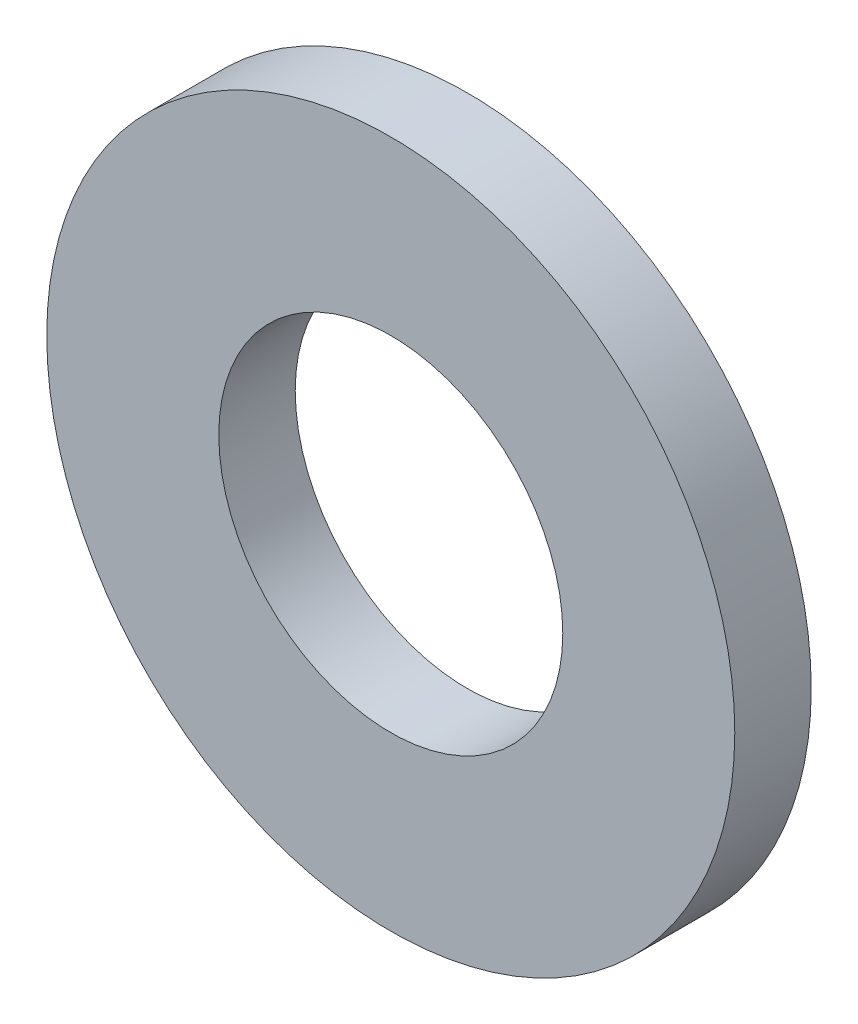
ISO-10303-21;
HEADER;
FILE_DESCRIPTION(('STEP AP214'),'2;1');
FILE_NAME('part.step','',(''),(''),'','','');
FILE_SCHEMA(('AUTOMOTIVE_DESIGN { 1 0 10303 214 1 1 1 1 }'));
ENDSEC;
DATA;
#1=APPLICATION_CONTEXT('core data for automotive mechanical design processes');
#2=APPLICATION_PROTOCOL_DEFINITION('international standard','automotive_design',2000,#1);
#3=PRODUCT_CONTEXT('',#1,'mechanical');
#4=PRODUCT('Part','Part','',(#3));
#5=PRODUCT_RELATED_PRODUCT_CATEGORY('part','',(#4));
#6=PRODUCT_DEFINITION_FORMATION('','',#4);
#7=PRODUCT_DEFINITION_CONTEXT('part definition',#1,'design');
#8=PRODUCT_DEFINITION('design','',#6,#7);
#9=PRODUCT_DEFINITION_SHAPE('','',#8);
#10=(LENGTH_UNIT() NAMED_UNIT(*) SI_UNIT(.MILLI.,.METRE.));
#11=(NAMED_UNIT(*) PLANE_ANGLE_UNIT() SI_UNIT($,.RADIAN.));
#12=(NAMED_UNIT(*) SI_UNIT($,.STERADIAN.) SOLID_ANGLE_UNIT());
#13=UNCERTAINTY_MEASURE_WITH_UNIT(LENGTH_MEASURE(1.E-05),#10,'distance_accuracy_value','');
#14=(GEOMETRIC_REPRESENTATION_CONTEXT(3) GLOBAL_UNCERTAINTY_ASSIGNED_CONTEXT((#13)) GLOBAL_UNIT_ASSIGNED_CONTEXT((#10,
#11,#12)) REPRESENTATION_CONTEXT('',''));
#15=CARTESIAN_POINT('',(0.,0.,0.));
#16=DIRECTION('',(0.,0.,1.));
#17=DIRECTION('',(1.,0.,0.));
#18=AXIS2_PLACEMENT_3D('',#15,#16,#17);
#19=CARTESIAN_POINT('',(0.,0.,1.));
#20=DIRECTION('',(0.,0.,1.));
#21=DIRECTION('',(1.,0.,0.));
#22=AXIS2_PLACEMENT_3D('',#19,#20,#21);
#23=PLANE('',#22);
#24=CARTESIAN_POINT('',(0.,0.,1.));
#25=DIRECTION('',(0.,0.,1.));
#26=DIRECTION('',(1.,0.,0.));
#27=AXIS2_PLACEMENT_3D('',#24,#25,#26);
#28=CIRCLE('',#27,4.5);
#29=CARTESIAN_POINT('',(4.5,0.,1.));
#30=VERTEX_POINT('',#29);
#31=EDGE_CURVE('E10',#30,#30,#28,.T.);
#32=ORIENTED_EDGE('',*,*,#31,.T.);
#33=EDGE_LOOP('',(#32));
#34=FACE_BOUND('',#33,.T.);
#35=CARTESIAN_POINT('',(0.,0.,1.));
#36=DIRECTION('',(0.,0.,1.));
#37=DIRECTION('',(1.,0.,0.));
#38=AXIS2_PLACEMENT_3D('',#35,#36,#37);
#39=CIRCLE('',#38,2.25);
#40=CARTESIAN_POINT('',(2.25,0.,1.));
#41=VERTEX_POINT('',#40);
#42=EDGE_CURVE('E42',#41,#41,#39,.T.);
#43=ORIENTED_EDGE('',*,*,#42,.F.);
#44=EDGE_LOOP('',(#43));
#45=FACE_BOUND('',#44,.T.);
#46=ADVANCED_FACE('F31',(#34,#45),#23,.T.);
#47=CARTESIAN_POINT('',(0.,0.,0.));
#48=DIRECTION('',(0.,0.,1.));
#49=DIRECTION('',(1.,0.,0.));
#50=AXIS2_PLACEMENT_3D('',#47,#48,#49);
#51=PLANE('',#50);
#52=CARTESIAN_POINT('',(0.,0.,0.));
#53=DIRECTION('',(0.,0.,1.));
#54=DIRECTION('',(1.,0.,0.));
#55=AXIS2_PLACEMENT_3D('',#52,#53,#54);
#56=CIRCLE('',#55,4.5);
#57=CARTESIAN_POINT('',(4.5,0.,0.));
#58=VERTEX_POINT('',#57);
#59=EDGE_CURVE('E35',#58,#58,#56,.T.);
#60=ORIENTED_EDGE('',*,*,#59,.F.);
#61=EDGE_LOOP('',(#60));
#62=FACE_BOUND('',#61,.T.);
#63=CARTESIAN_POINT('',(0.,0.,0.));
#64=DIRECTION('',(0.,0.,1.));
#65=DIRECTION('',(1.,0.,0.));
#66=AXIS2_PLACEMENT_3D('',#63,#64,#65);
#67=CIRCLE('',#66,2.25);
#68=CARTESIAN_POINT('',(2.25,0.,0.));
#69=VERTEX_POINT('',#68);
#70=EDGE_CURVE('E44',#69,#69,#67,.T.);
#71=ORIENTED_EDGE('',*,*,#70,.T.);
#72=EDGE_LOOP('',(#71));
#73=FACE_BOUND('',#72,.T.);
#74=ADVANCED_FACE('F54',(#62,#73),#51,.F.);
#75=CARTESIAN_POINT('',(0.,0.,1.));
#76=DIRECTION('',(0.,0.,-1.));
#77=DIRECTION('',(-1.,0.,0.));
#78=AXIS2_PLACEMENT_3D('',#75,#76,#77);
#79=CYLINDRICAL_SURFACE('',#78,4.5);
#80=ORIENTED_EDGE('',*,*,#31,.F.);
#81=EDGE_LOOP('',(#80));
#82=FACE_BOUND('',#81,.T.);
#83=ORIENTED_EDGE('',*,*,#59,.T.);
#84=EDGE_LOOP('',(#83));
#85=FACE_BOUND('',#84,.T.);
#86=ADVANCED_FACE('F33',(#82,#85),#79,.T.);
#87=CARTESIAN_POINT('',(0.,0.,1.));
#88=DIRECTION('',(0.,0.,-1.));
#89=DIRECTION('',(-1.,0.,0.));
#90=AXIS2_PLACEMENT_3D('',#87,#88,#89);
#91=CYLINDRICAL_SURFACE('',#90,2.25);
#92=ORIENTED_EDGE('',*,*,#42,.T.);
#93=EDGE_LOOP('',(#92));
#94=FACE_BOUND('',#93,.T.);
#95=ORIENTED_EDGE('',*,*,#70,.F.);
#96=EDGE_LOOP('',(#95));
#97=FACE_BOUND('',#96,.T.);
#98=ADVANCED_FACE('F50',(#94,#97),#91,.F.);
#99=CLOSED_SHELL('',(#46,#74,#86,#98));
#100=MANIFOLD_SOLID_BREP('B2',#99);
#101=ADVANCED_BREP_SHAPE_REPRESENTATION('',(#18,#100),#14);
#102=SHAPE_DEFINITION_REPRESENTATION(#9,#101);
ENDSEC;
END-ISO-10303-21;
